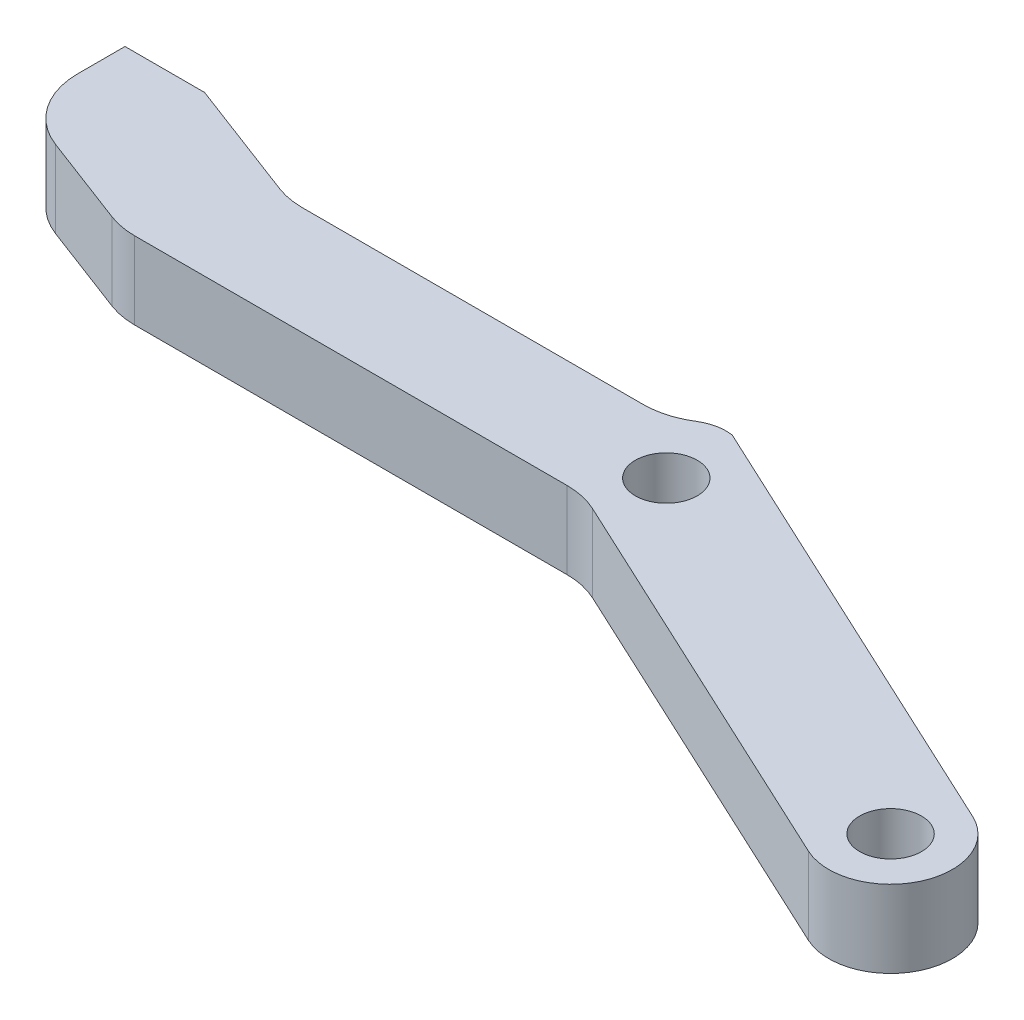
ISO-10303-21;
HEADER;
FILE_DESCRIPTION(('STEP AP214'),'2;1');
FILE_NAME('part.step','',(''),(''),'','','');
FILE_SCHEMA(('AUTOMOTIVE_DESIGN { 1 0 10303 214 1 1 1 1 }'));
ENDSEC;
DATA;
#1=APPLICATION_CONTEXT('core data for automotive mechanical design processes');
#2=APPLICATION_PROTOCOL_DEFINITION('international standard','automotive_design',2000,#1);
#3=PRODUCT_CONTEXT('',#1,'mechanical');
#4=PRODUCT('Part','Part','',(#3));
#5=PRODUCT_RELATED_PRODUCT_CATEGORY('part','',(#4));
#6=PRODUCT_DEFINITION_FORMATION('','',#4);
#7=PRODUCT_DEFINITION_CONTEXT('part definition',#1,'design');
#8=PRODUCT_DEFINITION('design','',#6,#7);
#9=PRODUCT_DEFINITION_SHAPE('','',#8);
#10=(LENGTH_UNIT() NAMED_UNIT(*) SI_UNIT(.MILLI.,.METRE.));
#11=(NAMED_UNIT(*) PLANE_ANGLE_UNIT() SI_UNIT($,.RADIAN.));
#12=(NAMED_UNIT(*) SI_UNIT($,.STERADIAN.) SOLID_ANGLE_UNIT());
#13=UNCERTAINTY_MEASURE_WITH_UNIT(LENGTH_MEASURE(1.E-05),#10,'distance_accuracy_value','');
#14=(GEOMETRIC_REPRESENTATION_CONTEXT(3) GLOBAL_UNCERTAINTY_ASSIGNED_CONTEXT((#13)) GLOBAL_UNIT_ASSIGNED_CONTEXT((#10,
#11,#12)) REPRESENTATION_CONTEXT('',''));
#15=CARTESIAN_POINT('',(0.,0.,0.));
#16=DIRECTION('',(0.,0.,1.));
#17=DIRECTION('',(1.,0.,0.));
#18=AXIS2_PLACEMENT_3D('',#15,#16,#17);
#19=CARTESIAN_POINT('',(40.974162817206,5.,-5.3869743906231));
#20=DIRECTION('',(0.,-1.,0.));
#21=DIRECTION('',(0.,0.,-1.));
#22=AXIS2_PLACEMENT_3D('',#19,#20,#21);
#23=PLANE('',#22);
#24=DIRECTION('',(0.,0.,1.));
#25=VECTOR('',#24,1.);
#26=CARTESIAN_POINT('',(0.,5.,-10.2949347198026));
#27=LINE('',#26,#25);
#28=CARTESIAN_POINT('',(0.,5.,-10.2949347198026));
#29=VERTEX_POINT('',#28);
#30=CARTESIAN_POINT('',(0.,5.,-7.24186872234071));
#31=VERTEX_POINT('',#30);
#32=EDGE_CURVE('E141',#29,#31,#27,.T.);
#33=ORIENTED_EDGE('',*,*,#32,.T.);
#34=CARTESIAN_POINT('',(5.,5.,-7.24186872234071));
#35=DIRECTION('',(0.,-1.,0.));
#36=DIRECTION('',(0.,0.,-1.));
#37=AXIS2_PLACEMENT_3D('',#34,#35,#36);
#38=CIRCLE('',#37,5.);
#39=CARTESIAN_POINT('',(3.22811142348579,5.,-2.56635689234622));
#40=VERTEX_POINT('',#39);
#41=EDGE_CURVE('E195',#31,#40,#38,.F.);
#42=ORIENTED_EDGE('',*,*,#41,.T.);
#43=DIRECTION('',(0.935102365998898,0.,0.354377715302843));
#44=VECTOR('',#43,1.);
#45=CARTESIAN_POINT('',(0.,5.,-3.78972108496686));
#46=LINE('',#45,#44);
#47=CARTESIAN_POINT('',(9.14376767384625,5.,-0.324488170005509));
#48=VERTEX_POINT('',#47);
#49=EDGE_CURVE('E151',#40,#48,#46,.T.);
#50=ORIENTED_EDGE('',*,*,#49,.T.);
#51=CARTESIAN_POINT('',(10.9156562503605,5.,-5.));
#52=DIRECTION('',(0.,-1.,0.));
#53=DIRECTION('',(0.,0.,-1.));
#54=AXIS2_PLACEMENT_3D('',#51,#52,#53);
#55=CIRCLE('',#54,5.);
#56=CARTESIAN_POINT('',(10.9156562503605,5.,0.));
#57=VERTEX_POINT('',#56);
#58=EDGE_CURVE('E193',#48,#57,#55,.F.);
#59=ORIENTED_EDGE('',*,*,#58,.T.);
#60=DIRECTION('',(1.,0.,0.));
#61=VECTOR('',#60,1.);
#62=CARTESIAN_POINT('',(10.,5.,0.));
#63=LINE('',#62,#61);
#64=CARTESIAN_POINT('',(38.8915266867853,5.,0.));
#65=VERTEX_POINT('',#64);
#66=EDGE_CURVE('E232',#57,#65,#63,.T.);
#67=ORIENTED_EDGE('',*,*,#66,.T.);
#68=CARTESIAN_POINT('',(38.8915266867853,5.,5.));
#69=DIRECTION('',(0.,-1.,0.));
#70=DIRECTION('',(0.,0.,-1.));
#71=AXIS2_PLACEMENT_3D('',#68,#69,#70);
#72=CIRCLE('',#71,5.);
#73=CARTESIAN_POINT('',(41.0046179954888,5.,0.468461064816734));
#74=VERTEX_POINT('',#73);
#75=EDGE_CURVE('E11',#65,#74,#72,.T.);
#76=ORIENTED_EDGE('',*,*,#75,.T.);
#77=DIRECTION('',(0.906307787036653,0.,0.422618261740693));
#78=VECTOR('',#77,1.);
#79=CARTESIAN_POINT('',(40.,5.,0.));
#80=LINE('',#79,#78);
#81=CARTESIAN_POINT('',(67.1892336110996,5.,12.6785478522208));
#82=VERTEX_POINT('',#81);
#83=EDGE_CURVE('E229',#74,#82,#80,.T.);
#84=ORIENTED_EDGE('',*,*,#83,.T.);
#85=CARTESIAN_POINT('',(68.8797066580624,5.,9.05331670407419));
#86=DIRECTION('',(0.,1.,0.));
#87=DIRECTION('',(0.,0.,1.));
#88=AXIS2_PLACEMENT_3D('',#85,#86,#87);
#89=CIRCLE('',#88,3.99999999999999);
#90=CARTESIAN_POINT('',(70.5701797050251,5.,5.42808555592759));
#91=VERTEX_POINT('',#90);
#92=EDGE_CURVE('E231',#82,#91,#89,.T.);
#93=ORIENTED_EDGE('',*,*,#92,.T.);
#94=DIRECTION('',(-0.906307787036652,0.,-0.422618261740694));
#95=VECTOR('',#94,1.);
#96=CARTESIAN_POINT('',(41.4211487178152,5.,-8.16433082120556));
#97=LINE('',#96,#95);
#98=CARTESIAN_POINT('',(41.4211487178152,5.,-8.16433082120556));
#99=VERTEX_POINT('',#98);
#100=EDGE_CURVE('E234',#91,#99,#97,.T.);
#101=ORIENTED_EDGE('',*,*,#100,.T.);
#102=CARTESIAN_POINT('',(40.974162817206,5.,-5.3869743906231));
#103=DIRECTION('',(0.,1.,0.));
#104=DIRECTION('',(0.,0.,-1.));
#105=AXIS2_PLACEMENT_3D('',#102,#103,#104);
#106=CIRCLE('',#105,2.81309529483825);
#107=CARTESIAN_POINT('',(39.4760678691452,5.,-7.76798607989217));
#108=VERTEX_POINT('',#107);
#109=EDGE_CURVE('E240',#99,#108,#106,.T.);
#110=ORIENTED_EDGE('',*,*,#109,.T.);
#111=CARTESIAN_POINT('',(36.8133515530474,5.,-12.));
#112=DIRECTION('',(0.,-1.,0.));
#113=DIRECTION('',(0.,0.,-1.));
#114=AXIS2_PLACEMENT_3D('',#111,#112,#113);
#115=CIRCLE('',#114,5.);
#116=CARTESIAN_POINT('',(36.8133515530474,5.,-7.));
#117=VERTEX_POINT('',#116);
#118=EDGE_CURVE('E206',#108,#117,#115,.T.);
#119=ORIENTED_EDGE('',*,*,#118,.T.);
#120=DIRECTION('',(-1.,0.,0.));
#121=VECTOR('',#120,1.);
#122=CARTESIAN_POINT('',(13.8430671016336,5.,-7.));
#123=LINE('',#122,#121);
#124=CARTESIAN_POINT('',(14.758723351994,5.,-7.));
#125=VERTEX_POINT('',#124);
#126=EDGE_CURVE('E243',#117,#125,#123,.T.);
#127=ORIENTED_EDGE('',*,*,#126,.T.);
#128=CARTESIAN_POINT('',(14.758723351994,5.,-12.));
#129=DIRECTION('',(0.,-1.,0.));
#130=DIRECTION('',(0.,0.,-1.));
#131=AXIS2_PLACEMENT_3D('',#128,#129,#130);
#132=CIRCLE('',#131,5.);
#133=CARTESIAN_POINT('',(12.9868347754798,5.,-7.32448817000551));
#134=VERTEX_POINT('',#133);
#135=EDGE_CURVE('E210',#125,#134,#132,.T.);
#136=ORIENTED_EDGE('',*,*,#135,.T.);
#137=DIRECTION('',(-0.935102365998898,0.,-0.354377715302843));
#138=VECTOR('',#137,1.);
#139=CARTESIAN_POINT('',(5.1486681051664,5.,-10.2949347198026));
#140=LINE('',#139,#138);
#141=CARTESIAN_POINT('',(5.1486681051664,5.,-10.2949347198026));
#142=VERTEX_POINT('',#141);
#143=EDGE_CURVE('E157',#134,#142,#140,.T.);
#144=ORIENTED_EDGE('',*,*,#143,.T.);
#145=DIRECTION('',(-1.,0.,0.));
#146=VECTOR('',#145,1.);
#147=CARTESIAN_POINT('',(0.,5.,-10.2949347198026));
#148=LINE('',#147,#146);
#149=EDGE_CURVE('E152',#142,#29,#148,.T.);
#150=ORIENTED_EDGE('',*,*,#149,.T.);
#151=EDGE_LOOP('',(#33,#42,#50,#59,#67,#76,#84,#93,#101,#110,#119,#127,#136,#144,#150));
#152=FACE_BOUND('',#151,.T.);
#153=CARTESIAN_POINT('',(68.8797066580624,5.,9.05331670407419));
#154=DIRECTION('',(0.,1.,0.));
#155=DIRECTION('',(0.,0.,1.));
#156=AXIS2_PLACEMENT_3D('',#153,#154,#155);
#157=CIRCLE('',#156,1.99999999999992);
#158=CARTESIAN_POINT('',(68.8797066580624,5.,11.0533167040741));
#159=VERTEX_POINT('',#158);
#160=EDGE_CURVE('E250',#159,#159,#157,.T.);
#161=ORIENTED_EDGE('',*,*,#160,.F.);
#162=EDGE_LOOP('',(#161));
#163=FACE_BOUND('',#162,.T.);
#164=CARTESIAN_POINT('',(41.6904730469628,5.,-3.62523114814662));
#165=DIRECTION('',(0.,1.,0.));
#166=DIRECTION('',(0.,0.,1.));
#167=AXIS2_PLACEMENT_3D('',#164,#165,#166);
#168=CIRCLE('',#167,2.00000000000002);
#169=CARTESIAN_POINT('',(41.6904730469628,5.,-1.6252311481466));
#170=VERTEX_POINT('',#169);
#171=EDGE_CURVE('E311',#170,#170,#168,.T.);
#172=ORIENTED_EDGE('',*,*,#171,.F.);
#173=EDGE_LOOP('',(#172));
#174=FACE_BOUND('',#173,.T.);
#175=ADVANCED_FACE('F34',(#152,#163,#174),#23,.F.);
#176=CARTESIAN_POINT('',(40.974162817206,0.,-5.3869743906231));
#177=DIRECTION('',(0.,-1.,0.));
#178=DIRECTION('',(0.,0.,-1.));
#179=AXIS2_PLACEMENT_3D('',#176,#177,#178);
#180=PLANE('',#179);
#181=CARTESIAN_POINT('',(68.8797066580624,0.,9.05331670407419));
#182=DIRECTION('',(0.,1.,0.));
#183=DIRECTION('',(0.,0.,1.));
#184=AXIS2_PLACEMENT_3D('',#181,#182,#183);
#185=CIRCLE('',#184,1.99999999999992);
#186=CARTESIAN_POINT('',(68.8797066580624,0.,11.0533167040741));
#187=VERTEX_POINT('',#186);
#188=EDGE_CURVE('E308',#187,#187,#185,.T.);
#189=ORIENTED_EDGE('',*,*,#188,.T.);
#190=EDGE_LOOP('',(#189));
#191=FACE_BOUND('',#190,.T.);
#192=DIRECTION('',(0.935102365998898,0.,0.354377715302843));
#193=VECTOR('',#192,1.);
#194=CARTESIAN_POINT('',(0.,0.,-3.78972108496686));
#195=LINE('',#194,#193);
#196=CARTESIAN_POINT('',(3.22811142348579,0.,-2.56635689234622));
#197=VERTEX_POINT('',#196);
#198=CARTESIAN_POINT('',(9.14376767384625,0.,-0.324488170005509));
#199=VERTEX_POINT('',#198);
#200=EDGE_CURVE('E224',#197,#199,#195,.T.);
#201=ORIENTED_EDGE('',*,*,#200,.F.);
#202=CARTESIAN_POINT('',(5.,0.,-7.24186872234071));
#203=DIRECTION('',(0.,-1.,0.));
#204=DIRECTION('',(0.,0.,-1.));
#205=AXIS2_PLACEMENT_3D('',#202,#203,#204);
#206=CIRCLE('',#205,5.);
#207=CARTESIAN_POINT('',(0.,0.,-7.24186872234071));
#208=VERTEX_POINT('',#207);
#209=EDGE_CURVE('E190',#197,#208,#206,.T.);
#210=ORIENTED_EDGE('',*,*,#209,.T.);
#211=DIRECTION('',(0.,0.,1.));
#212=VECTOR('',#211,1.);
#213=CARTESIAN_POINT('',(0.,0.,-10.2949347198026));
#214=LINE('',#213,#212);
#215=CARTESIAN_POINT('',(0.,0.,-10.2949347198026));
#216=VERTEX_POINT('',#215);
#217=EDGE_CURVE('E249',#216,#208,#214,.T.);
#218=ORIENTED_EDGE('',*,*,#217,.F.);
#219=DIRECTION('',(-1.,0.,0.));
#220=VECTOR('',#219,1.);
#221=CARTESIAN_POINT('',(0.,0.,-10.2949347198026));
#222=LINE('',#221,#220);
#223=CARTESIAN_POINT('',(5.1486681051664,0.,-10.2949347198026));
#224=VERTEX_POINT('',#223);
#225=EDGE_CURVE('E165',#224,#216,#222,.T.);
#226=ORIENTED_EDGE('',*,*,#225,.F.);
#227=DIRECTION('',(-0.935102365998898,0.,-0.354377715302843));
#228=VECTOR('',#227,1.);
#229=CARTESIAN_POINT('',(5.1486681051664,0.,-10.2949347198026));
#230=LINE('',#229,#228);
#231=CARTESIAN_POINT('',(12.9868347754798,0.,-7.32448817000551));
#232=VERTEX_POINT('',#231);
#233=EDGE_CURVE('E161',#232,#224,#230,.T.);
#234=ORIENTED_EDGE('',*,*,#233,.F.);
#235=CARTESIAN_POINT('',(14.758723351994,0.,-12.));
#236=DIRECTION('',(0.,-1.,0.));
#237=DIRECTION('',(0.,0.,-1.));
#238=AXIS2_PLACEMENT_3D('',#235,#236,#237);
#239=CIRCLE('',#238,5.);
#240=CARTESIAN_POINT('',(14.758723351994,0.,-7.));
#241=VERTEX_POINT('',#240);
#242=EDGE_CURVE('E208',#232,#241,#239,.F.);
#243=ORIENTED_EDGE('',*,*,#242,.T.);
#244=DIRECTION('',(-1.,0.,0.));
#245=VECTOR('',#244,1.);
#246=CARTESIAN_POINT('',(13.8430671016336,0.,-7.));
#247=LINE('',#246,#245);
#248=CARTESIAN_POINT('',(36.8133515530474,0.,-7.));
#249=VERTEX_POINT('',#248);
#250=EDGE_CURVE('E262',#249,#241,#247,.T.);
#251=ORIENTED_EDGE('',*,*,#250,.F.);
#252=CARTESIAN_POINT('',(36.8133515530474,0.,-12.));
#253=DIRECTION('',(0.,-1.,0.));
#254=DIRECTION('',(0.,0.,-1.));
#255=AXIS2_PLACEMENT_3D('',#252,#253,#254);
#256=CIRCLE('',#255,5.);
#257=CARTESIAN_POINT('',(39.4760678691452,0.,-7.76798607989217));
#258=VERTEX_POINT('',#257);
#259=EDGE_CURVE('E204',#249,#258,#256,.F.);
#260=ORIENTED_EDGE('',*,*,#259,.T.);
#261=CARTESIAN_POINT('',(40.974162817206,0.,-5.3869743906231));
#262=DIRECTION('',(0.,1.,0.));
#263=DIRECTION('',(0.,0.,-1.));
#264=AXIS2_PLACEMENT_3D('',#261,#262,#263);
#265=CIRCLE('',#264,2.81309529483825);
#266=CARTESIAN_POINT('',(41.4211487178152,0.,-8.16433082120556));
#267=VERTEX_POINT('',#266);
#268=EDGE_CURVE('E259',#267,#258,#265,.T.);
#269=ORIENTED_EDGE('',*,*,#268,.F.);
#270=DIRECTION('',(-0.906307787036652,0.,-0.422618261740694));
#271=VECTOR('',#270,1.);
#272=CARTESIAN_POINT('',(41.4211487178152,0.,-8.16433082120556));
#273=LINE('',#272,#271);
#274=CARTESIAN_POINT('',(70.5701797050251,0.,5.42808555592759));
#275=VERTEX_POINT('',#274);
#276=EDGE_CURVE('E257',#275,#267,#273,.T.);
#277=ORIENTED_EDGE('',*,*,#276,.F.);
#278=CARTESIAN_POINT('',(68.8797066580624,0.,9.05331670407419));
#279=DIRECTION('',(0.,1.,0.));
#280=DIRECTION('',(0.,0.,1.));
#281=AXIS2_PLACEMENT_3D('',#278,#279,#280);
#282=CIRCLE('',#281,3.99999999999999);
#283=CARTESIAN_POINT('',(67.1892336110996,0.,12.6785478522208));
#284=VERTEX_POINT('',#283);
#285=EDGE_CURVE('E255',#284,#275,#282,.T.);
#286=ORIENTED_EDGE('',*,*,#285,.F.);
#287=DIRECTION('',(0.906307787036653,0.,0.422618261740693));
#288=VECTOR('',#287,1.);
#289=CARTESIAN_POINT('',(40.,0.,0.));
#290=LINE('',#289,#288);
#291=CARTESIAN_POINT('',(41.0046179954888,0.,0.468461064816734));
#292=VERTEX_POINT('',#291);
#293=EDGE_CURVE('E219',#292,#284,#290,.T.);
#294=ORIENTED_EDGE('',*,*,#293,.F.);
#295=CARTESIAN_POINT('',(38.8915266867853,0.,5.));
#296=DIRECTION('',(0.,-1.,0.));
#297=DIRECTION('',(0.,0.,-1.));
#298=AXIS2_PLACEMENT_3D('',#295,#296,#297);
#299=CIRCLE('',#298,5.);
#300=CARTESIAN_POINT('',(38.8915266867853,0.,0.));
#301=VERTEX_POINT('',#300);
#302=EDGE_CURVE('E42',#292,#301,#299,.F.);
#303=ORIENTED_EDGE('',*,*,#302,.T.);
#304=DIRECTION('',(1.,0.,0.));
#305=VECTOR('',#304,1.);
#306=CARTESIAN_POINT('',(10.,0.,0.));
#307=LINE('',#306,#305);
#308=CARTESIAN_POINT('',(10.9156562503605,0.,0.));
#309=VERTEX_POINT('',#308);
#310=EDGE_CURVE('E217',#309,#301,#307,.T.);
#311=ORIENTED_EDGE('',*,*,#310,.F.);
#312=CARTESIAN_POINT('',(10.9156562503605,0.,-5.));
#313=DIRECTION('',(0.,-1.,0.));
#314=DIRECTION('',(0.,0.,-1.));
#315=AXIS2_PLACEMENT_3D('',#312,#313,#314);
#316=CIRCLE('',#315,5.);
#317=EDGE_CURVE('E188',#309,#199,#316,.T.);
#318=ORIENTED_EDGE('',*,*,#317,.T.);
#319=EDGE_LOOP('',(#201,#210,#218,#226,#234,#243,#251,#260,#269,#277,#286,#294,#303,#311,#318));
#320=FACE_BOUND('',#319,.T.);
#321=CARTESIAN_POINT('',(41.6904730469628,0.,-3.62523114814662));
#322=DIRECTION('',(0.,1.,0.));
#323=DIRECTION('',(0.,0.,1.));
#324=AXIS2_PLACEMENT_3D('',#321,#322,#323);
#325=CIRCLE('',#324,2.00000000000002);
#326=CARTESIAN_POINT('',(41.6904730469628,0.,-1.6252311481466));
#327=VERTEX_POINT('',#326);
#328=EDGE_CURVE('E314',#327,#327,#325,.T.);
#329=ORIENTED_EDGE('',*,*,#328,.T.);
#330=EDGE_LOOP('',(#329));
#331=FACE_BOUND('',#330,.T.);
#332=ADVANCED_FACE('F215',(#191,#320,#331),#180,.T.);
#333=CARTESIAN_POINT('',(0.,5.,-10.2949347198026));
#334=DIRECTION('',(0.,0.,1.));
#335=DIRECTION('',(1.,0.,0.));
#336=AXIS2_PLACEMENT_3D('',#333,#334,#335);
#337=PLANE('',#336);
#338=ORIENTED_EDGE('',*,*,#225,.T.);
#339=DIRECTION('',(0.,-1.,0.));
#340=VECTOR('',#339,1.);
#341=CARTESIAN_POINT('',(0.,5.,-10.2949347198026));
#342=LINE('',#341,#340);
#343=EDGE_CURVE('E146',#29,#216,#342,.T.);
#344=ORIENTED_EDGE('',*,*,#343,.F.);
#345=ORIENTED_EDGE('',*,*,#149,.F.);
#346=DIRECTION('',(0.,-1.,0.));
#347=VECTOR('',#346,1.);
#348=CARTESIAN_POINT('',(5.1486681051664,5.,-10.2949347198026));
#349=LINE('',#348,#347);
#350=EDGE_CURVE('E247',#142,#224,#349,.T.);
#351=ORIENTED_EDGE('',*,*,#350,.T.);
#352=EDGE_LOOP('',(#338,#344,#345,#351));
#353=FACE_BOUND('',#352,.T.);
#354=ADVANCED_FACE('F163',(#353),#337,.F.);
#355=CARTESIAN_POINT('',(0.,5.,-10.2949347198026));
#356=DIRECTION('',(1.,0.,0.));
#357=DIRECTION('',(0.,0.,-1.));
#358=AXIS2_PLACEMENT_3D('',#355,#356,#357);
#359=PLANE('',#358);
#360=ORIENTED_EDGE('',*,*,#217,.T.);
#361=DIRECTION('',(0.,-1.,0.));
#362=VECTOR('',#361,1.);
#363=CARTESIAN_POINT('',(0.,5.,-7.24186872234071));
#364=LINE('',#363,#362);
#365=EDGE_CURVE('E149',#208,#31,#364,.F.);
#366=ORIENTED_EDGE('',*,*,#365,.T.);
#367=ORIENTED_EDGE('',*,*,#32,.F.);
#368=ORIENTED_EDGE('',*,*,#343,.T.);
#369=EDGE_LOOP('',(#360,#366,#367,#368));
#370=FACE_BOUND('',#369,.T.);
#371=ADVANCED_FACE('F144',(#370),#359,.F.);
#372=CARTESIAN_POINT('',(0.,5.,-3.78972108496686));
#373=DIRECTION('',(0.354377715302843,0.,-0.935102365998898));
#374=DIRECTION('',(-0.935102365998898,0.,-0.354377715302843));
#375=AXIS2_PLACEMENT_3D('',#372,#373,#374);
#376=PLANE('',#375);
#377=ORIENTED_EDGE('',*,*,#49,.F.);
#378=DIRECTION('',(0.,-1.,0.));
#379=VECTOR('',#378,1.);
#380=CARTESIAN_POINT('',(3.22811142348579,5.,-2.56635689234622));
#381=LINE('',#380,#379);
#382=EDGE_CURVE('E185',#40,#197,#381,.T.);
#383=ORIENTED_EDGE('',*,*,#382,.T.);
#384=ORIENTED_EDGE('',*,*,#200,.T.);
#385=DIRECTION('',(0.,-1.,0.));
#386=VECTOR('',#385,1.);
#387=CARTESIAN_POINT('',(9.14376767384625,5.,-0.324488170005507));
#388=LINE('',#387,#386);
#389=EDGE_CURVE('E183',#199,#48,#388,.F.);
#390=ORIENTED_EDGE('',*,*,#389,.T.);
#391=EDGE_LOOP('',(#377,#383,#384,#390));
#392=FACE_BOUND('',#391,.T.);
#393=ADVANCED_FACE('F305',(#392),#376,.F.);
#394=CARTESIAN_POINT('',(10.,5.,0.));
#395=DIRECTION('',(0.,0.,-1.));
#396=DIRECTION('',(-1.,0.,0.));
#397=AXIS2_PLACEMENT_3D('',#394,#395,#396);
#398=PLANE('',#397);
#399=ORIENTED_EDGE('',*,*,#66,.F.);
#400=DIRECTION('',(0.,-1.,0.));
#401=VECTOR('',#400,1.);
#402=CARTESIAN_POINT('',(10.9156562503605,5.,0.));
#403=LINE('',#402,#401);
#404=EDGE_CURVE('E198',#57,#309,#403,.T.);
#405=ORIENTED_EDGE('',*,*,#404,.T.);
#406=ORIENTED_EDGE('',*,*,#310,.T.);
#407=DIRECTION('',(0.,-1.,0.));
#408=VECTOR('',#407,1.);
#409=CARTESIAN_POINT('',(38.8915266867853,5.,0.));
#410=LINE('',#409,#408);
#411=EDGE_CURVE('E55',#301,#65,#410,.F.);
#412=ORIENTED_EDGE('',*,*,#411,.T.);
#413=EDGE_LOOP('',(#399,#405,#406,#412));
#414=FACE_BOUND('',#413,.T.);
#415=ADVANCED_FACE('F222',(#414),#398,.F.);
#416=CARTESIAN_POINT('',(40.,5.,0.));
#417=DIRECTION('',(0.422618261740693,0.,-0.906307787036653));
#418=DIRECTION('',(-0.906307787036653,0.,-0.422618261740693));
#419=AXIS2_PLACEMENT_3D('',#416,#417,#418);
#420=PLANE('',#419);
#421=ORIENTED_EDGE('',*,*,#83,.F.);
#422=DIRECTION('',(0.,-1.,0.));
#423=VECTOR('',#422,1.);
#424=CARTESIAN_POINT('',(41.0046179954888,0.,0.468461064816734));
#425=LINE('',#424,#423);
#426=EDGE_CURVE('E201',#74,#292,#425,.T.);
#427=ORIENTED_EDGE('',*,*,#426,.T.);
#428=ORIENTED_EDGE('',*,*,#293,.T.);
#429=DIRECTION('',(0.,-1.,0.));
#430=VECTOR('',#429,1.);
#431=CARTESIAN_POINT('',(67.1892336110996,5.,12.6785478522208));
#432=LINE('',#431,#430);
#433=EDGE_CURVE('E167',#82,#284,#432,.T.);
#434=ORIENTED_EDGE('',*,*,#433,.F.);
#435=EDGE_LOOP('',(#421,#427,#428,#434));
#436=FACE_BOUND('',#435,.T.);
#437=ADVANCED_FACE('F227',(#436),#420,.F.);
#438=CARTESIAN_POINT('',(68.8797066580624,5.,9.05331670407419));
#439=DIRECTION('',(0.,-1.,0.));
#440=DIRECTION('',(0.,0.,-1.));
#441=AXIS2_PLACEMENT_3D('',#438,#439,#440);
#442=CYLINDRICAL_SURFACE('',#441,3.99999999999999);
#443=ORIENTED_EDGE('',*,*,#285,.T.);
#444=DIRECTION('',(0.,-1.,0.));
#445=VECTOR('',#444,1.);
#446=CARTESIAN_POINT('',(70.5701797050251,5.,5.42808555592759));
#447=LINE('',#446,#445);
#448=EDGE_CURVE('E172',#91,#275,#447,.T.);
#449=ORIENTED_EDGE('',*,*,#448,.F.);
#450=ORIENTED_EDGE('',*,*,#92,.F.);
#451=ORIENTED_EDGE('',*,*,#433,.T.);
#452=EDGE_LOOP('',(#443,#449,#450,#451));
#453=FACE_BOUND('',#452,.T.);
#454=ADVANCED_FACE('F342',(#453),#442,.T.);
#455=CARTESIAN_POINT('',(41.4211487178152,5.,-8.16433082120556));
#456=DIRECTION('',(-0.422618261740694,0.,0.906307787036653));
#457=DIRECTION('',(0.906307787036653,0.,0.422618261740694));
#458=AXIS2_PLACEMENT_3D('',#455,#456,#457);
#459=PLANE('',#458);
#460=ORIENTED_EDGE('',*,*,#276,.T.);
#461=DIRECTION('',(0.,-1.,0.));
#462=VECTOR('',#461,1.);
#463=CARTESIAN_POINT('',(41.4211487178152,5.,-8.16433082120556));
#464=LINE('',#463,#462);
#465=EDGE_CURVE('E267',#99,#267,#464,.T.);
#466=ORIENTED_EDGE('',*,*,#465,.F.);
#467=ORIENTED_EDGE('',*,*,#100,.F.);
#468=ORIENTED_EDGE('',*,*,#448,.T.);
#469=EDGE_LOOP('',(#460,#466,#467,#468));
#470=FACE_BOUND('',#469,.T.);
#471=ADVANCED_FACE('F274',(#470),#459,.F.);
#472=CARTESIAN_POINT('',(40.974162817206,5.,-5.3869743906231));
#473=DIRECTION('',(0.,-1.,0.));
#474=DIRECTION('',(0.,0.,-1.));
#475=AXIS2_PLACEMENT_3D('',#472,#473,#474);
#476=CYLINDRICAL_SURFACE('',#475,2.81309529483825);
#477=ORIENTED_EDGE('',*,*,#268,.T.);
#478=DIRECTION('',(0.,-1.,0.));
#479=VECTOR('',#478,1.);
#480=CARTESIAN_POINT('',(39.4760678691452,5.,-7.76798607989217));
#481=LINE('',#480,#479);
#482=EDGE_CURVE('E178',#258,#108,#481,.F.);
#483=ORIENTED_EDGE('',*,*,#482,.T.);
#484=ORIENTED_EDGE('',*,*,#109,.F.);
#485=ORIENTED_EDGE('',*,*,#465,.T.);
#486=EDGE_LOOP('',(#477,#483,#484,#485));
#487=FACE_BOUND('',#486,.T.);
#488=ADVANCED_FACE('F281',(#487),#476,.T.);
#489=CARTESIAN_POINT('',(13.8430671016336,5.,-7.));
#490=DIRECTION('',(0.,0.,1.));
#491=DIRECTION('',(1.,0.,0.));
#492=AXIS2_PLACEMENT_3D('',#489,#490,#491);
#493=PLANE('',#492);
#494=ORIENTED_EDGE('',*,*,#126,.F.);
#495=DIRECTION('',(0.,1.,0.));
#496=VECTOR('',#495,1.);
#497=CARTESIAN_POINT('',(36.8133515530474,0.,-7.));
#498=LINE('',#497,#496);
#499=EDGE_CURVE('E169',#117,#249,#498,.F.);
#500=ORIENTED_EDGE('',*,*,#499,.T.);
#501=ORIENTED_EDGE('',*,*,#250,.T.);
#502=DIRECTION('',(0.,-1.,0.));
#503=VECTOR('',#502,1.);
#504=CARTESIAN_POINT('',(14.758723351994,5.,-7.));
#505=LINE('',#504,#503);
#506=EDGE_CURVE('E166',#241,#125,#505,.F.);
#507=ORIENTED_EDGE('',*,*,#506,.T.);
#508=EDGE_LOOP('',(#494,#500,#501,#507));
#509=FACE_BOUND('',#508,.T.);
#510=ADVANCED_FACE('F290',(#509),#493,.F.);
#511=CARTESIAN_POINT('',(5.1486681051664,5.,-10.2949347198026));
#512=DIRECTION('',(-0.354377715302843,0.,0.935102365998898));
#513=DIRECTION('',(0.935102365998898,0.,0.354377715302843));
#514=AXIS2_PLACEMENT_3D('',#511,#512,#513);
#515=PLANE('',#514);
#516=ORIENTED_EDGE('',*,*,#143,.F.);
#517=DIRECTION('',(0.,-1.,0.));
#518=VECTOR('',#517,1.);
#519=CARTESIAN_POINT('',(12.9868347754798,0.,-7.32448817000551));
#520=LINE('',#519,#518);
#521=EDGE_CURVE('E180',#134,#232,#520,.T.);
#522=ORIENTED_EDGE('',*,*,#521,.T.);
#523=ORIENTED_EDGE('',*,*,#233,.T.);
#524=ORIENTED_EDGE('',*,*,#350,.F.);
#525=EDGE_LOOP('',(#516,#522,#523,#524));
#526=FACE_BOUND('',#525,.T.);
#527=ADVANCED_FACE('F296',(#526),#515,.F.);
#528=CARTESIAN_POINT('',(68.8797066580624,5.,9.05331670407419));
#529=DIRECTION('',(0.,-1.,0.));
#530=DIRECTION('',(0.,0.,-1.));
#531=AXIS2_PLACEMENT_3D('',#528,#529,#530);
#532=CYLINDRICAL_SURFACE('',#531,1.99999999999992);
#533=ORIENTED_EDGE('',*,*,#160,.T.);
#534=EDGE_LOOP('',(#533));
#535=FACE_BOUND('',#534,.T.);
#536=ORIENTED_EDGE('',*,*,#188,.F.);
#537=EDGE_LOOP('',(#536));
#538=FACE_BOUND('',#537,.T.);
#539=ADVANCED_FACE('F331',(#535,#538),#532,.F.);
#540=CARTESIAN_POINT('',(41.6904730469628,5.,-3.62523114814662));
#541=DIRECTION('',(0.,-1.,0.));
#542=DIRECTION('',(0.,0.,-1.));
#543=AXIS2_PLACEMENT_3D('',#540,#541,#542);
#544=CYLINDRICAL_SURFACE('',#543,2.00000000000002);
#545=ORIENTED_EDGE('',*,*,#171,.T.);
#546=EDGE_LOOP('',(#545));
#547=FACE_BOUND('',#546,.T.);
#548=ORIENTED_EDGE('',*,*,#328,.F.);
#549=EDGE_LOOP('',(#548));
#550=FACE_BOUND('',#549,.T.);
#551=ADVANCED_FACE('F320',(#547,#550),#544,.F.);
#552=CARTESIAN_POINT('',(36.8133515530474,5.,-12.));
#553=DIRECTION('',(0.,-1.,0.));
#554=DIRECTION('',(0.,0.,-1.));
#555=AXIS2_PLACEMENT_3D('',#552,#553,#554);
#556=CYLINDRICAL_SURFACE('',#555,5.);
#557=ORIENTED_EDGE('',*,*,#118,.F.);
#558=ORIENTED_EDGE('',*,*,#482,.F.);
#559=ORIENTED_EDGE('',*,*,#259,.F.);
#560=ORIENTED_EDGE('',*,*,#499,.F.);
#561=EDGE_LOOP('',(#557,#558,#559,#560));
#562=FACE_BOUND('',#561,.T.);
#563=ADVANCED_FACE('F285',(#562),#556,.F.);
#564=CARTESIAN_POINT('',(14.758723351994,5.,-12.));
#565=DIRECTION('',(0.,1.,0.));
#566=DIRECTION('',(0.,0.,1.));
#567=AXIS2_PLACEMENT_3D('',#564,#565,#566);
#568=CYLINDRICAL_SURFACE('',#567,5.);
#569=ORIENTED_EDGE('',*,*,#135,.F.);
#570=ORIENTED_EDGE('',*,*,#506,.F.);
#571=ORIENTED_EDGE('',*,*,#242,.F.);
#572=ORIENTED_EDGE('',*,*,#521,.F.);
#573=EDGE_LOOP('',(#569,#570,#571,#572));
#574=FACE_BOUND('',#573,.T.);
#575=ADVANCED_FACE('F293',(#574),#568,.F.);
#576=CARTESIAN_POINT('',(5.,5.,-7.24186872234071));
#577=DIRECTION('',(0.,-1.,0.));
#578=DIRECTION('',(0.,0.,-1.));
#579=AXIS2_PLACEMENT_3D('',#576,#577,#578);
#580=CYLINDRICAL_SURFACE('',#579,5.);
#581=ORIENTED_EDGE('',*,*,#41,.F.);
#582=ORIENTED_EDGE('',*,*,#365,.F.);
#583=ORIENTED_EDGE('',*,*,#209,.F.);
#584=ORIENTED_EDGE('',*,*,#382,.F.);
#585=EDGE_LOOP('',(#581,#582,#583,#584));
#586=FACE_BOUND('',#585,.T.);
#587=ADVANCED_FACE('F299',(#586),#580,.T.);
#588=CARTESIAN_POINT('',(10.9156562503605,5.,-5.));
#589=DIRECTION('',(0.,-1.,0.));
#590=DIRECTION('',(0.,0.,-1.));
#591=AXIS2_PLACEMENT_3D('',#588,#589,#590);
#592=CYLINDRICAL_SURFACE('',#591,5.);
#593=ORIENTED_EDGE('',*,*,#58,.F.);
#594=ORIENTED_EDGE('',*,*,#389,.F.);
#595=ORIENTED_EDGE('',*,*,#317,.F.);
#596=ORIENTED_EDGE('',*,*,#404,.F.);
#597=EDGE_LOOP('',(#593,#594,#595,#596));
#598=FACE_BOUND('',#597,.T.);
#599=ADVANCED_FACE('F360',(#598),#592,.T.);
#600=CARTESIAN_POINT('',(38.8915266867853,5.,5.));
#601=DIRECTION('',(0.,1.,0.));
#602=DIRECTION('',(0.,0.,1.));
#603=AXIS2_PLACEMENT_3D('',#600,#601,#602);
#604=CYLINDRICAL_SURFACE('',#603,5.);
#605=ORIENTED_EDGE('',*,*,#75,.F.);
#606=ORIENTED_EDGE('',*,*,#411,.F.);
#607=ORIENTED_EDGE('',*,*,#302,.F.);
#608=ORIENTED_EDGE('',*,*,#426,.F.);
#609=EDGE_LOOP('',(#605,#606,#607,#608));
#610=FACE_BOUND('',#609,.T.);
#611=ADVANCED_FACE('F36',(#610),#604,.F.);
#612=CLOSED_SHELL('',(#175,#332,#354,#371,#393,#415,#437,#454,#471,#488,#510,#527,#539,#551,
#563,#575,#587,#599,#611));
#613=MANIFOLD_SOLID_BREP('B2',#612);
#614=ADVANCED_BREP_SHAPE_REPRESENTATION('',(#18,#613),#14);
#615=SHAPE_DEFINITION_REPRESENTATION(#9,#614);
ENDSEC;
END-ISO-10303-21;
